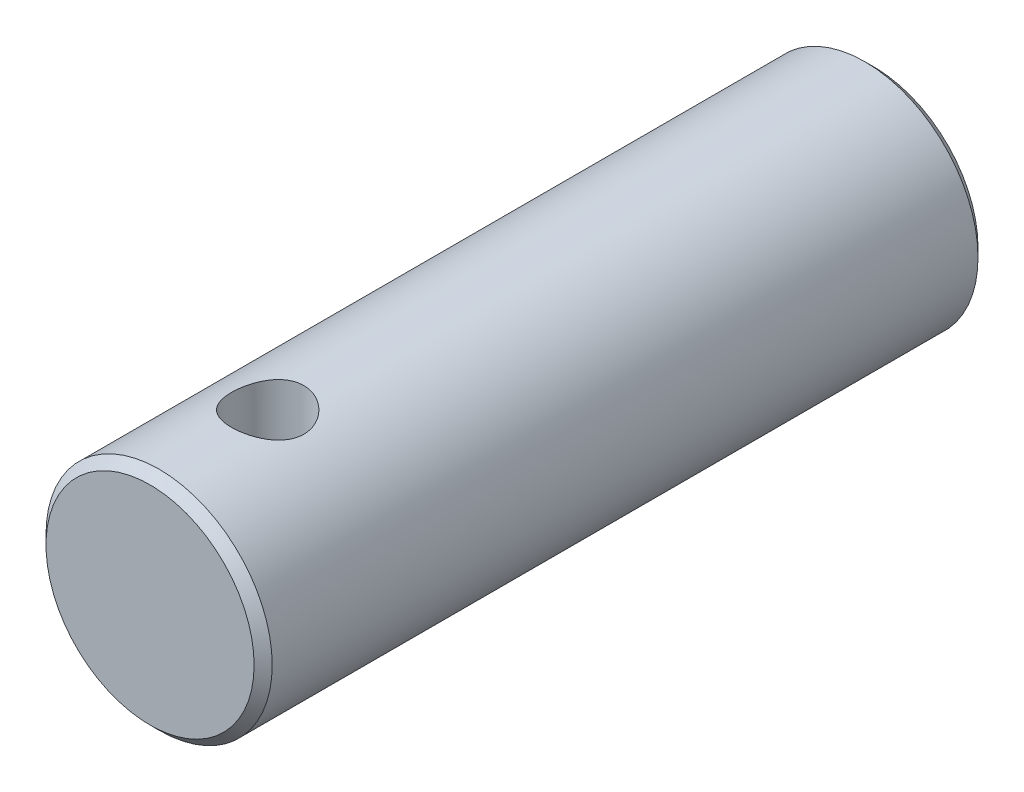
ISO-10303-21;
HEADER;
FILE_DESCRIPTION(('STEP AP214'),'2;1');
FILE_NAME('part.step','',(''),(''),'','','');
FILE_SCHEMA(('AUTOMOTIVE_DESIGN { 1 0 10303 214 1 1 1 1 }'));
ENDSEC;
DATA;
#1=APPLICATION_CONTEXT('core data for automotive mechanical design processes');
#2=APPLICATION_PROTOCOL_DEFINITION('international standard','automotive_design',2000,#1);
#3=PRODUCT_CONTEXT('',#1,'mechanical');
#4=PRODUCT('Part','Part','',(#3));
#5=PRODUCT_RELATED_PRODUCT_CATEGORY('part','',(#4));
#6=PRODUCT_DEFINITION_FORMATION('','',#4);
#7=PRODUCT_DEFINITION_CONTEXT('part definition',#1,'design');
#8=PRODUCT_DEFINITION('design','',#6,#7);
#9=PRODUCT_DEFINITION_SHAPE('','',#8);
#10=(LENGTH_UNIT() NAMED_UNIT(*) SI_UNIT(.MILLI.,.METRE.));
#11=(NAMED_UNIT(*) PLANE_ANGLE_UNIT() SI_UNIT($,.RADIAN.));
#12=(NAMED_UNIT(*) SI_UNIT($,.STERADIAN.) SOLID_ANGLE_UNIT());
#13=UNCERTAINTY_MEASURE_WITH_UNIT(LENGTH_MEASURE(1.E-05),#10,'distance_accuracy_value','');
#14=(GEOMETRIC_REPRESENTATION_CONTEXT(3) GLOBAL_UNCERTAINTY_ASSIGNED_CONTEXT((#13)) GLOBAL_UNIT_ASSIGNED_CONTEXT((#10,
#11,#12)) REPRESENTATION_CONTEXT('',''));
#15=CARTESIAN_POINT('',(0.,0.,0.));
#16=DIRECTION('',(0.,0.,1.));
#17=DIRECTION('',(1.,0.,0.));
#18=AXIS2_PLACEMENT_3D('',#15,#16,#17);
#19=CARTESIAN_POINT('',(0.,0.,80.));
#20=DIRECTION('',(0.,0.,-1.));
#21=DIRECTION('',(-1.,0.,0.));
#22=AXIS2_PLACEMENT_3D('',#19,#20,#21);
#23=CYLINDRICAL_SURFACE('',#22,12.5);
#24=CARTESIAN_POINT('',(0.,0.,1.00000000000003));
#25=DIRECTION('',(0.,0.,1.));
#26=DIRECTION('',(1.,0.,0.));
#27=AXIS2_PLACEMENT_3D('',#24,#25,#26);
#28=CIRCLE('',#27,12.5);
#29=CARTESIAN_POINT('',(12.5,0.,1.00000000000003));
#30=VERTEX_POINT('',#29);
#31=EDGE_CURVE('E61',#30,#30,#28,.T.);
#32=ORIENTED_EDGE('',*,*,#31,.T.);
#33=EDGE_LOOP('',(#32));
#34=FACE_BOUND('',#33,.T.);
#35=CARTESIAN_POINT('',(0.,0.,79.));
#36=DIRECTION('',(0.,0.,1.));
#37=DIRECTION('',(1.,0.,0.));
#38=AXIS2_PLACEMENT_3D('',#35,#36,#37);
#39=CIRCLE('',#38,12.5);
#40=CARTESIAN_POINT('',(12.5,0.,79.));
#41=VERTEX_POINT('',#40);
#42=EDGE_CURVE('E66',#41,#41,#39,.F.);
#43=ORIENTED_EDGE('',*,*,#42,.T.);
#44=EDGE_LOOP('',(#43));
#45=FACE_BOUND('',#44,.T.);
#46=CARTESIAN_POINT('',(0.,12.5,71.));
#47=CARTESIAN_POINT('',(-0.21873951578995,12.4999994635907,70.9999993908736));
#48=CARTESIAN_POINT('',(-0.437486592647653,12.4942046039089,70.9819985118019));
#49=CARTESIAN_POINT('',(-0.868567253093709,12.4716565543057,70.9106704511769));
#50=CARTESIAN_POINT('',(-1.08089965843427,12.454901363839,70.8573368204552));
#51=CARTESIAN_POINT('',(-1.49287306447892,12.4122595908852,70.7173376969706));
#52=CARTESIAN_POINT('',(-1.69253368346149,12.3863875511298,70.6307252690735));
#53=CARTESIAN_POINT('',(-2.0744969071279,12.3281725410718,70.4268579247818));
#54=CARTESIAN_POINT('',(-2.25679651756237,12.2958284575098,70.309597735586));
#55=CARTESIAN_POINT('',(-2.60473689448745,12.2269266983455,70.0437897162399));
#56=CARTESIAN_POINT('',(-2.76974023061599,12.1902739433225,69.8944322526164));
#57=CARTESIAN_POINT('',(-3.07283559233071,12.1174266425772,69.5703923336315));
#58=CARTESIAN_POINT('',(-3.21092229484498,12.0812321888099,69.3957048808629));
#59=CARTESIAN_POINT('',(-3.45978487684573,12.012370269974,69.0203678637239));
#60=CARTESIAN_POINT('',(-3.56975307774838,11.9798196408788,68.8191592968232));
#61=CARTESIAN_POINT('',(-3.75402292836496,11.9233664449728,68.3998941405751));
#62=CARTESIAN_POINT('',(-3.82833449433394,11.8994614742253,68.1818422550308));
#63=CARTESIAN_POINT('',(-3.93682835778228,11.8640030689908,67.7422934818163));
#64=CARTESIAN_POINT('',(-3.97219742115686,11.8520853732299,67.5211197456144));
#65=CARTESIAN_POINT('',(-4.00551082647403,11.8408707762137,67.0756810020443));
#66=CARTESIAN_POINT('',(-4.00346567735333,11.8415703310132,66.8514168803904));
#67=CARTESIAN_POINT('',(-3.96293451839877,11.8551904771854,66.4160860377509));
#68=CARTESIAN_POINT('',(-3.92597105327876,11.8676004346024,66.204858866299));
#69=CARTESIAN_POINT('',(-3.81912647431513,11.9024114349979,65.7917778888601));
#70=CARTESIAN_POINT('',(-3.74924170672461,11.9248135869381,65.5899251260173));
#71=CARTESIAN_POINT('',(-3.57749112898223,11.9774663544073,65.197755352963));
#72=CARTESIAN_POINT('',(-3.47515682759625,12.007830736819,65.0076594501287));
#73=CARTESIAN_POINT('',(-3.24173735834846,12.0729361214443,64.6468448924257));
#74=CARTESIAN_POINT('',(-3.11064442067797,12.1076783053403,64.4761314931391));
#75=CARTESIAN_POINT('',(-2.81601378851057,12.1796593035711,64.1503383178364));
#76=CARTESIAN_POINT('',(-2.65122340623528,12.216938020211,63.9963980576535));
#77=CARTESIAN_POINT('',(-2.29770358054261,12.2883292028654,63.7180533044153));
#78=CARTESIAN_POINT('',(-2.10897218913165,12.3224414108409,63.5936512171426));
#79=CARTESIAN_POINT('',(-1.71065395178099,12.3840447436164,63.3770913917996));
#80=CARTESIAN_POINT('',(-1.50090319860159,12.411477013699,63.285217247909));
#81=CARTESIAN_POINT('',(-1.06783962590279,12.4562040275044,63.1384010083432));
#82=CARTESIAN_POINT('',(-0.844531157828846,12.4735020051158,63.0834471304582));
#83=CARTESIAN_POINT('',(-0.40035447397328,12.4954856059785,63.013999833337));
#84=CARTESIAN_POINT('',(-0.179750715042665,12.5006515044539,62.9979648159723));
#85=CARTESIAN_POINT('',(0.261025673970288,12.4992163829611,63.0024480455533));
#86=CARTESIAN_POINT('',(0.481198365218622,12.4926171751051,63.0229606632747));
#87=CARTESIAN_POINT('',(0.908837545509553,12.4687095079374,63.0987252827029));
#88=CARTESIAN_POINT('',(1.11648590619508,12.4516871662316,63.1530497752148));
#89=CARTESIAN_POINT('',(1.51965413650148,12.4089396498837,63.2937544984906));
#90=CARTESIAN_POINT('',(1.71517248448534,12.3832133859887,63.3801387415054));
#91=CARTESIAN_POINT('',(2.09399230967614,12.3248882754976,63.5849275429454));
#92=CARTESIAN_POINT('',(2.27686405125244,12.2921331567522,63.7040812798558));
#93=CARTESIAN_POINT('',(2.62052875751657,12.223485206012,63.9701346824641));
#94=CARTESIAN_POINT('',(2.78131543888498,12.187591485802,64.1170422161458));
#95=CARTESIAN_POINT('',(3.0832080372159,12.1148241820809,64.4416853990274));
#96=CARTESIAN_POINT('',(3.22321448689053,12.0779721041684,64.6204506692212));
#97=CARTESIAN_POINT('',(3.47135354981425,12.0090110777536,64.9997366861456));
#98=CARTESIAN_POINT('',(3.57948642564106,11.9769020901785,65.2002572536352));
#99=CARTESIAN_POINT('',(3.7601895075308,11.9214065721644,65.6171089466402));
#100=CARTESIAN_POINT('',(3.83287665768616,11.8979914205013,65.8333853374743));
#101=CARTESIAN_POINT('',(3.94051670615504,11.8627820424832,66.2760180245258));
#102=CARTESIAN_POINT('',(3.97548487516419,11.8509831134183,66.50237020284));
#103=CARTESIAN_POINT('',(4.00556338278916,11.8408481974692,66.94718992291));
#104=CARTESIAN_POINT('',(4.00248471115016,11.8419004772846,67.1655225283225));
#105=CARTESIAN_POINT('',(3.96095887873426,11.8558539773436,67.5983925135868));
#106=CARTESIAN_POINT('',(3.92251352152803,11.8687545933658,67.8129300864026));
#107=CARTESIAN_POINT('',(3.81258331041154,11.9045135786104,68.2287085634422));
#108=CARTESIAN_POINT('',(3.74164069856766,11.9272081809191,68.4301079972322));
#109=CARTESIAN_POINT('',(3.56916068710955,11.979949389859,68.8183044010021));
#110=CARTESIAN_POINT('',(3.46761685286565,12.009997542498,69.0050982894068));
#111=CARTESIAN_POINT('',(3.23198166768581,12.0755873592094,69.367024074536));
#112=CARTESIAN_POINT('',(3.09673271078947,12.111302976317,69.5413706568351));
#113=CARTESIAN_POINT('',(2.79953499482211,12.1834295211838,69.8654793645524));
#114=CARTESIAN_POINT('',(2.63757895417058,12.2198406361674,70.0152347629966));
#115=CARTESIAN_POINT('',(2.28478052574588,12.2907777050029,70.2911457148096));
#116=CARTESIAN_POINT('',(2.09312837940195,12.3251937970096,70.4162973797108));
#117=CARTESIAN_POINT('',(1.69040882481734,12.3868446924465,70.6324504702431));
#118=CARTESIAN_POINT('',(1.47934815802039,12.4140819767823,70.723463698302));
#119=CARTESIAN_POINT('',(1.05915857911211,12.4567085266016,70.8631194495761));
#120=CARTESIAN_POINT('',(0.85094191621832,12.4727975325363,70.9142961264578));
#121=CARTESIAN_POINT('',(0.428485002690296,12.4944423385348,70.98273285726));
#122=CARTESIAN_POINT('',(0.214246128153486,12.5000005253903,71.0000005966137));
#123=CARTESIAN_POINT('',(0.,12.5,71.));
#124=B_SPLINE_CURVE_WITH_KNOTS('',3,(#46,#47,#48,#49,#50,#51,#52,#53,#54,#55,#56,#57,#58,#59,
#60,#61,#62,#63,#64,#65,#66,#67,#68,#69,#70,#71,#72,#73,#74,#75,#76,#77,#78,#79,#80,#81,#82,#83,
#84,#85,#86,#87,#88,#89,#90,#91,#92,#93,#94,#95,#96,#97,#98,#99,#100,#101,#102,#103,#104,#105,
#106,#107,#108,#109,#110,#111,#112,#113,#114,#115,#116,#117,#118,#119,#120,#121,#122,#123),
.UNSPECIFIED.,.T.,.F.,(4,2,2,2,2,2,2,2,2,2,2,2,2,2,2,2,2,2,2,2,2,2,2,2,2,2,2,2,2,2,2,2,2,2,2,2,
2,2,4),(0.,0.65543072466622,1.31098111587091,1.96549050527929,2.62011257411758,3.29374295378918,
3.96750641671065,4.65887072066566,5.35004264179887,6.01951224998768,6.6887938198556,
7.33017723381302,7.97163184802042,8.62280489842005,9.2741540953762,9.95668212026654,
10.6392657156648,11.3276617834058,12.0158380617097,12.6762752648346,13.3366107533684,
13.9795854097457,14.6226405610093,15.281833876428,15.9412143491714,16.6280748263775,
17.3149296449995,17.9995027669286,18.6837986322709,19.3356533743721,19.9874748761257,
20.6287955720839,21.2702512150686,21.937843916949,22.6056189371905,23.2966571383325,
23.9874562112942,24.6295685076846,25.2715352530413),.UNSPECIFIED.);
#125=CARTESIAN_POINT('',(0.,12.5,71.));
#126=VERTEX_POINT('',#125);
#127=EDGE_CURVE('E72',#126,#126,#124,.T.);
#128=ORIENTED_EDGE('',*,*,#127,.T.);
#129=EDGE_LOOP('',(#128));
#130=FACE_BOUND('',#129,.T.);
#131=ADVANCED_FACE('F47',(#34,#45,#130),#23,.T.);
#132=CARTESIAN_POINT('',(0.,0.,80.));
#133=DIRECTION('',(0.,0.,1.));
#134=DIRECTION('',(1.,0.,0.));
#135=AXIS2_PLACEMENT_3D('',#132,#133,#134);
#136=PLANE('',#135);
#137=CARTESIAN_POINT('',(0.,0.,80.));
#138=DIRECTION('',(0.,0.,1.));
#139=DIRECTION('',(1.,0.,0.));
#140=AXIS2_PLACEMENT_3D('',#137,#138,#139);
#141=CIRCLE('',#140,11.5);
#142=CARTESIAN_POINT('',(11.5,0.,80.));
#143=VERTEX_POINT('',#142);
#144=EDGE_CURVE('E10',#143,#143,#141,.T.);
#145=ORIENTED_EDGE('',*,*,#144,.T.);
#146=EDGE_LOOP('',(#145));
#147=FACE_BOUND('',#146,.T.);
#148=ADVANCED_FACE('F92',(#147),#136,.T.);
#149=CARTESIAN_POINT('',(0.,0.,0.));
#150=DIRECTION('',(0.,0.,1.));
#151=DIRECTION('',(1.,0.,0.));
#152=AXIS2_PLACEMENT_3D('',#149,#150,#151);
#153=PLANE('',#152);
#154=CARTESIAN_POINT('',(0.,0.,0.));
#155=DIRECTION('',(0.,0.,1.));
#156=DIRECTION('',(1.,0.,0.));
#157=AXIS2_PLACEMENT_3D('',#154,#155,#156);
#158=CIRCLE('',#157,11.5);
#159=CARTESIAN_POINT('',(11.5,0.,0.));
#160=VERTEX_POINT('',#159);
#161=EDGE_CURVE('E56',#160,#160,#158,.F.);
#162=ORIENTED_EDGE('',*,*,#161,.T.);
#163=EDGE_LOOP('',(#162));
#164=FACE_BOUND('',#163,.T.);
#165=ADVANCED_FACE('F90',(#164),#153,.F.);
#166=CARTESIAN_POINT('',(0.,4.5,67.));
#167=DIRECTION('',(0.,1.,0.));
#168=DIRECTION('',(0.,0.,1.));
#169=AXIS2_PLACEMENT_3D('',#166,#167,#168);
#170=CYLINDRICAL_SURFACE('',#169,4.);
#171=CARTESIAN_POINT('',(0.,4.5,67.));
#172=DIRECTION('',(0.,1.,0.));
#173=DIRECTION('',(0.,0.,1.));
#174=AXIS2_PLACEMENT_3D('',#171,#172,#173);
#175=CIRCLE('',#174,4.);
#176=CARTESIAN_POINT('',(0.,4.5,71.));
#177=VERTEX_POINT('',#176);
#178=EDGE_CURVE('E81',#177,#177,#175,.T.);
#179=ORIENTED_EDGE('',*,*,#178,.F.);
#180=EDGE_LOOP('',(#179));
#181=FACE_BOUND('',#180,.T.);
#182=ORIENTED_EDGE('',*,*,#127,.F.);
#183=EDGE_LOOP('',(#182));
#184=FACE_BOUND('',#183,.T.);
#185=ADVANCED_FACE('F84',(#181,#184),#170,.F.);
#186=CARTESIAN_POINT('',(0.,4.5,67.));
#187=DIRECTION('',(0.,1.,0.));
#188=DIRECTION('',(0.,0.,1.));
#189=AXIS2_PLACEMENT_3D('',#186,#187,#188);
#190=PLANE('',#189);
#191=ORIENTED_EDGE('',*,*,#178,.T.);
#192=EDGE_LOOP('',(#191));
#193=FACE_BOUND('',#192,.T.);
#194=ADVANCED_FACE('F89',(#193),#190,.T.);
#195=CARTESIAN_POINT('',(0.,0.,1.00000000000003));
#196=DIRECTION('',(0.,0.,1.));
#197=DIRECTION('',(1.,0.,0.));
#198=AXIS2_PLACEMENT_3D('',#195,#196,#197);
#199=CONICAL_SURFACE('',#198,12.5,0.78539816339745);
#200=ORIENTED_EDGE('',*,*,#161,.F.);
#201=EDGE_LOOP('',(#200));
#202=FACE_BOUND('',#201,.T.);
#203=ORIENTED_EDGE('',*,*,#31,.F.);
#204=EDGE_LOOP('',(#203));
#205=FACE_BOUND('',#204,.T.);
#206=ADVANCED_FACE('F110',(#202,#205),#199,.T.);
#207=CARTESIAN_POINT('',(0.,0.,80.));
#208=DIRECTION('',(0.,0.,-1.));
#209=DIRECTION('',(-1.,0.,0.));
#210=AXIS2_PLACEMENT_3D('',#207,#208,#209);
#211=CONICAL_SURFACE('',#210,11.5,0.785398163397443);
#212=ORIENTED_EDGE('',*,*,#42,.F.);
#213=EDGE_LOOP('',(#212));
#214=FACE_BOUND('',#213,.T.);
#215=ORIENTED_EDGE('',*,*,#144,.F.);
#216=EDGE_LOOP('',(#215));
#217=FACE_BOUND('',#216,.T.);
#218=ADVANCED_FACE('F50',(#214,#217),#211,.T.);
#219=CLOSED_SHELL('',(#131,#148,#165,#185,#194,#206,#218));
#220=MANIFOLD_SOLID_BREP('B2',#219);
#221=ADVANCED_BREP_SHAPE_REPRESENTATION('',(#18,#220),#14);
#222=SHAPE_DEFINITION_REPRESENTATION(#9,#221);
ENDSEC;
END-ISO-10303-21;
